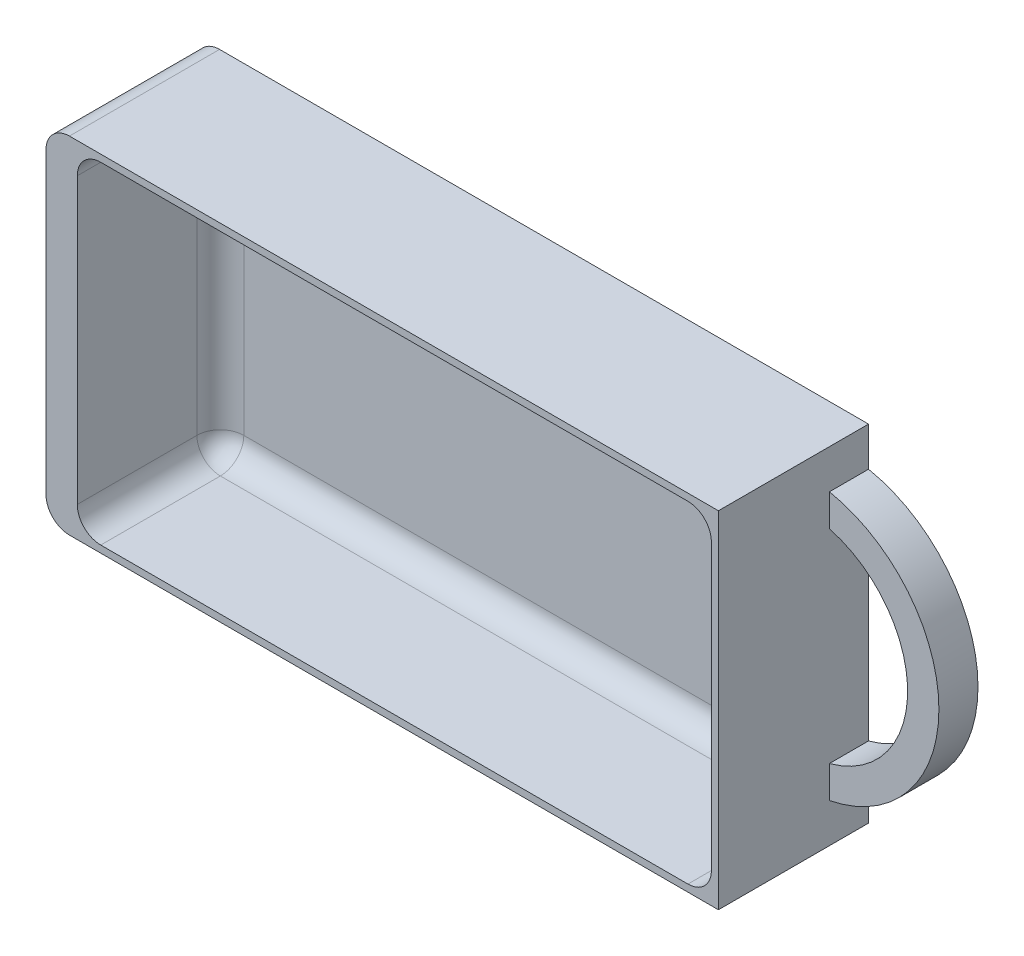
ISO-10303-21;
HEADER;
FILE_DESCRIPTION(('STEP AP214'),'2;1');
FILE_NAME('part.step','',(''),(''),'','','');
FILE_SCHEMA(('AUTOMOTIVE_DESIGN { 1 0 10303 214 1 1 1 1 }'));
ENDSEC;
DATA;
#1=APPLICATION_CONTEXT('core data for automotive mechanical design processes');
#2=APPLICATION_PROTOCOL_DEFINITION('international standard','automotive_design',2000,#1);
#3=PRODUCT_CONTEXT('',#1,'mechanical');
#4=PRODUCT('Part','Part','',(#3));
#5=PRODUCT_RELATED_PRODUCT_CATEGORY('part','',(#4));
#6=PRODUCT_DEFINITION_FORMATION('','',#4);
#7=PRODUCT_DEFINITION_CONTEXT('part definition',#1,'design');
#8=PRODUCT_DEFINITION('design','',#6,#7);
#9=PRODUCT_DEFINITION_SHAPE('','',#8);
#10=(LENGTH_UNIT() NAMED_UNIT(*) SI_UNIT(.MILLI.,.METRE.));
#11=(NAMED_UNIT(*) PLANE_ANGLE_UNIT() SI_UNIT($,.RADIAN.));
#12=(NAMED_UNIT(*) SI_UNIT($,.STERADIAN.) SOLID_ANGLE_UNIT());
#13=UNCERTAINTY_MEASURE_WITH_UNIT(LENGTH_MEASURE(1.E-05),#10,'distance_accuracy_value','');
#14=(GEOMETRIC_REPRESENTATION_CONTEXT(3) GLOBAL_UNCERTAINTY_ASSIGNED_CONTEXT((#13)) GLOBAL_UNIT_ASSIGNED_CONTEXT((#10,
#11,#12)) REPRESENTATION_CONTEXT('',''));
#15=CARTESIAN_POINT('',(0.,0.,0.));
#16=DIRECTION('',(0.,0.,1.));
#17=DIRECTION('',(1.,0.,0.));
#18=AXIS2_PLACEMENT_3D('',#15,#16,#17);
#19=CARTESIAN_POINT('',(86.1,18.2,-5.7));
#20=DIRECTION('',(1.,0.,0.));
#21=DIRECTION('',(0.,1.,0.));
#22=AXIS2_PLACEMENT_3D('',#19,#20,#21);
#23=SPHERICAL_SURFACE('',#22,3.);
#24=CARTESIAN_POINT('',(86.1,18.2,-5.7));
#25=DIRECTION('',(0.,0.,-1.));
#26=DIRECTION('',(-1.,0.,0.));
#27=AXIS2_PLACEMENT_3D('',#24,#25,#26);
#28=CIRCLE('',#27,3.);
#29=CARTESIAN_POINT('',(86.1,21.2,-5.7));
#30=VERTEX_POINT('',#29);
#31=CARTESIAN_POINT('',(89.1,18.2,-5.7));
#32=VERTEX_POINT('',#31);
#33=EDGE_CURVE('E56',#30,#32,#28,.T.);
#34=ORIENTED_EDGE('',*,*,#33,.F.);
#35=CARTESIAN_POINT('',(86.1,18.2,-5.7));
#36=DIRECTION('',(-1.,0.,0.));
#37=DIRECTION('',(0.,0.,1.));
#38=AXIS2_PLACEMENT_3D('',#35,#36,#37);
#39=CIRCLE('',#38,3.);
#40=CARTESIAN_POINT('',(86.1,18.2,-8.7));
#41=VERTEX_POINT('',#40);
#42=EDGE_CURVE('E324',#41,#30,#39,.F.);
#43=ORIENTED_EDGE('',*,*,#42,.F.);
#44=CARTESIAN_POINT('',(86.1,18.2,-5.7));
#45=DIRECTION('',(0.,-1.,0.));
#46=DIRECTION('',(0.,0.,-1.));
#47=AXIS2_PLACEMENT_3D('',#44,#45,#46);
#48=CIRCLE('',#47,3.);
#49=EDGE_CURVE('E336',#41,#32,#48,.T.);
#50=ORIENTED_EDGE('',*,*,#49,.T.);
#51=EDGE_LOOP('',(#34,#43,#50));
#52=FACE_BOUND('',#51,.T.);
#53=ADVANCED_FACE('F33',(#52),#23,.F.);
#54=CARTESIAN_POINT('',(86.1,0.,-5.7));
#55=DIRECTION('',(0.,1.,0.));
#56=DIRECTION('',(-1.,0.,0.));
#57=AXIS2_PLACEMENT_3D('',#54,#55,#56);
#58=CYLINDRICAL_SURFACE('',#57,3.);
#59=ORIENTED_EDGE('',*,*,#49,.F.);
#60=DIRECTION('',(0.,1.,0.));
#61=VECTOR('',#60,1.);
#62=CARTESIAN_POINT('',(86.1,0.,-8.7));
#63=LINE('',#62,#61);
#64=CARTESIAN_POINT('',(86.1,-18.2,-8.7));
#65=VERTEX_POINT('',#64);
#66=EDGE_CURVE('E321',#65,#41,#63,.T.);
#67=ORIENTED_EDGE('',*,*,#66,.F.);
#68=CARTESIAN_POINT('',(86.1,-18.2,-5.7));
#69=DIRECTION('',(0.,-1.,0.));
#70=DIRECTION('',(0.,0.,-1.));
#71=AXIS2_PLACEMENT_3D('',#68,#69,#70);
#72=CIRCLE('',#71,3.);
#73=CARTESIAN_POINT('',(89.1,-18.2,-5.7));
#74=VERTEX_POINT('',#73);
#75=EDGE_CURVE('E334',#65,#74,#72,.T.);
#76=ORIENTED_EDGE('',*,*,#75,.T.);
#77=DIRECTION('',(0.,1.,0.));
#78=VECTOR('',#77,1.);
#79=CARTESIAN_POINT('',(89.1,-21.2,-5.7));
#80=LINE('',#79,#78);
#81=EDGE_CURVE('E312',#32,#74,#80,.F.);
#82=ORIENTED_EDGE('',*,*,#81,.F.);
#83=EDGE_LOOP('',(#59,#67,#76,#82));
#84=FACE_BOUND('',#83,.T.);
#85=ADVANCED_FACE('F342',(#84),#58,.F.);
#86=CARTESIAN_POINT('',(86.1,-18.2,-5.7));
#87=DIRECTION('',(1.,0.,0.));
#88=DIRECTION('',(0.,1.,0.));
#89=AXIS2_PLACEMENT_3D('',#86,#87,#88);
#90=SPHERICAL_SURFACE('',#89,3.);
#91=ORIENTED_EDGE('',*,*,#75,.F.);
#92=CARTESIAN_POINT('',(86.1,-18.2,-5.7));
#93=DIRECTION('',(-1.,0.,0.));
#94=DIRECTION('',(0.,-1.,0.));
#95=AXIS2_PLACEMENT_3D('',#92,#93,#94);
#96=CIRCLE('',#95,3.);
#97=CARTESIAN_POINT('',(86.1,-21.2,-5.7));
#98=VERTEX_POINT('',#97);
#99=EDGE_CURVE('E318',#98,#65,#96,.F.);
#100=ORIENTED_EDGE('',*,*,#99,.F.);
#101=CARTESIAN_POINT('',(86.1,-18.2,-5.7));
#102=DIRECTION('',(0.,0.,1.));
#103=DIRECTION('',(1.,0.,0.));
#104=AXIS2_PLACEMENT_3D('',#101,#102,#103);
#105=CIRCLE('',#104,3.);
#106=EDGE_CURVE('E331',#98,#74,#105,.T.);
#107=ORIENTED_EDGE('',*,*,#106,.T.);
#108=EDGE_LOOP('',(#91,#100,#107));
#109=FACE_BOUND('',#108,.T.);
#110=ADVANCED_FACE('F463',(#109),#90,.F.);
#111=CARTESIAN_POINT('',(86.1,-18.2,-8.7));
#112=DIRECTION('',(0.,0.,1.));
#113=DIRECTION('',(1.,0.,0.));
#114=AXIS2_PLACEMENT_3D('',#111,#112,#113);
#115=CYLINDRICAL_SURFACE('',#114,3.);
#116=ORIENTED_EDGE('',*,*,#106,.F.);
#117=DIRECTION('',(0.,0.,-1.));
#118=VECTOR('',#117,1.);
#119=CARTESIAN_POINT('',(86.1,-21.2,-8.7));
#120=LINE('',#119,#118);
#121=CARTESIAN_POINT('',(86.1,-21.2,9.6));
#122=VERTEX_POINT('',#121);
#123=EDGE_CURVE('E306',#122,#98,#120,.T.);
#124=ORIENTED_EDGE('',*,*,#123,.F.);
#125=CARTESIAN_POINT('',(86.1,-18.2,9.6));
#126=DIRECTION('',(0.,0.,1.));
#127=DIRECTION('',(1.,0.,0.));
#128=AXIS2_PLACEMENT_3D('',#125,#126,#127);
#129=CIRCLE('',#128,3.);
#130=CARTESIAN_POINT('',(89.1,-18.2,9.6));
#131=VERTEX_POINT('',#130);
#132=EDGE_CURVE('E329',#122,#131,#129,.T.);
#133=ORIENTED_EDGE('',*,*,#132,.T.);
#134=DIRECTION('',(0.,0.,-1.));
#135=VECTOR('',#134,1.);
#136=CARTESIAN_POINT('',(89.1,-18.2,-8.7));
#137=LINE('',#136,#135);
#138=EDGE_CURVE('E315',#74,#131,#137,.F.);
#139=ORIENTED_EDGE('',*,*,#138,.F.);
#140=EDGE_LOOP('',(#116,#124,#133,#139));
#141=FACE_BOUND('',#140,.T.);
#142=ADVANCED_FACE('F460',(#141),#115,.F.);
#143=CARTESIAN_POINT('',(86.1,18.2,-8.7));
#144=DIRECTION('',(0.,0.,-1.));
#145=DIRECTION('',(-1.,0.,0.));
#146=AXIS2_PLACEMENT_3D('',#143,#144,#145);
#147=CYLINDRICAL_SURFACE('',#146,3.);
#148=DIRECTION('',(0.,0.,1.));
#149=VECTOR('',#148,1.);
#150=CARTESIAN_POINT('',(86.1,21.2,-8.7));
#151=LINE('',#150,#149);
#152=CARTESIAN_POINT('',(86.1,21.2,9.6));
#153=VERTEX_POINT('',#152);
#154=EDGE_CURVE('E327',#30,#153,#151,.T.);
#155=ORIENTED_EDGE('',*,*,#154,.F.);
#156=ORIENTED_EDGE('',*,*,#33,.T.);
#157=DIRECTION('',(0.,0.,1.));
#158=VECTOR('',#157,1.);
#159=CARTESIAN_POINT('',(89.1,18.2,-8.7));
#160=LINE('',#159,#158);
#161=CARTESIAN_POINT('',(89.1,18.2,9.6));
#162=VERTEX_POINT('',#161);
#163=EDGE_CURVE('E309',#162,#32,#160,.F.);
#164=ORIENTED_EDGE('',*,*,#163,.F.);
#165=CARTESIAN_POINT('',(86.1,18.2,9.6));
#166=DIRECTION('',(0.,0.,1.));
#167=DIRECTION('',(1.,0.,0.));
#168=AXIS2_PLACEMENT_3D('',#165,#166,#167);
#169=CIRCLE('',#168,3.);
#170=EDGE_CURVE('E42',#162,#153,#169,.T.);
#171=ORIENTED_EDGE('',*,*,#170,.T.);
#172=EDGE_LOOP('',(#155,#156,#164,#171));
#173=FACE_BOUND('',#172,.T.);
#174=ADVANCED_FACE('F35',(#173),#147,.F.);
#175=CARTESIAN_POINT('',(11.,-18.2,-5.7));
#176=DIRECTION('',(-1.,0.,0.));
#177=DIRECTION('',(0.,-1.,0.));
#178=AXIS2_PLACEMENT_3D('',#175,#176,#177);
#179=SPHERICAL_SURFACE('',#178,3.);
#180=CARTESIAN_POINT('',(11.,-18.2,-5.7));
#181=DIRECTION('',(0.,0.,-1.));
#182=DIRECTION('',(-1.,0.,0.));
#183=AXIS2_PLACEMENT_3D('',#180,#181,#182);
#184=CIRCLE('',#183,3.);
#185=CARTESIAN_POINT('',(11.,-21.2,-5.7));
#186=VERTEX_POINT('',#185);
#187=CARTESIAN_POINT('',(8.,-18.2,-5.7));
#188=VERTEX_POINT('',#187);
#189=EDGE_CURVE('E302',#186,#188,#184,.T.);
#190=ORIENTED_EDGE('',*,*,#189,.F.);
#191=CARTESIAN_POINT('',(11.,-18.2,-5.7));
#192=DIRECTION('',(-1.,0.,0.));
#193=DIRECTION('',(0.,-1.,0.));
#194=AXIS2_PLACEMENT_3D('',#191,#192,#193);
#195=CIRCLE('',#194,3.);
#196=CARTESIAN_POINT('',(11.,-18.2,-8.7));
#197=VERTEX_POINT('',#196);
#198=EDGE_CURVE('E286',#197,#186,#195,.T.);
#199=ORIENTED_EDGE('',*,*,#198,.F.);
#200=CARTESIAN_POINT('',(11.,-18.2,-5.7));
#201=DIRECTION('',(0.,1.,0.));
#202=DIRECTION('',(0.,0.,1.));
#203=AXIS2_PLACEMENT_3D('',#200,#201,#202);
#204=CIRCLE('',#203,3.);
#205=EDGE_CURVE('E299',#197,#188,#204,.T.);
#206=ORIENTED_EDGE('',*,*,#205,.T.);
#207=EDGE_LOOP('',(#190,#199,#206));
#208=FACE_BOUND('',#207,.T.);
#209=ADVANCED_FACE('F452',(#208),#179,.F.);
#210=CARTESIAN_POINT('',(11.,0.,-5.7));
#211=DIRECTION('',(0.,-1.,0.));
#212=DIRECTION('',(1.,0.,0.));
#213=AXIS2_PLACEMENT_3D('',#210,#211,#212);
#214=CYLINDRICAL_SURFACE('',#213,3.);
#215=ORIENTED_EDGE('',*,*,#205,.F.);
#216=DIRECTION('',(0.,-1.,0.));
#217=VECTOR('',#216,1.);
#218=CARTESIAN_POINT('',(11.,0.,-8.7));
#219=LINE('',#218,#217);
#220=CARTESIAN_POINT('',(11.,18.2,-8.7));
#221=VERTEX_POINT('',#220);
#222=EDGE_CURVE('E283',#221,#197,#219,.T.);
#223=ORIENTED_EDGE('',*,*,#222,.F.);
#224=CARTESIAN_POINT('',(11.,18.2,-5.7));
#225=DIRECTION('',(0.,1.,0.));
#226=DIRECTION('',(0.,0.,1.));
#227=AXIS2_PLACEMENT_3D('',#224,#225,#226);
#228=CIRCLE('',#227,3.);
#229=CARTESIAN_POINT('',(8.,18.2,-5.7));
#230=VERTEX_POINT('',#229);
#231=EDGE_CURVE('E297',#221,#230,#228,.T.);
#232=ORIENTED_EDGE('',*,*,#231,.T.);
#233=DIRECTION('',(0.,-1.,0.));
#234=VECTOR('',#233,1.);
#235=CARTESIAN_POINT('',(8.,21.2,-5.7));
#236=LINE('',#235,#234);
#237=EDGE_CURVE('E274',#188,#230,#236,.F.);
#238=ORIENTED_EDGE('',*,*,#237,.F.);
#239=EDGE_LOOP('',(#215,#223,#232,#238));
#240=FACE_BOUND('',#239,.T.);
#241=ADVANCED_FACE('F448',(#240),#214,.F.);
#242=CARTESIAN_POINT('',(11.,18.2,-5.7));
#243=DIRECTION('',(-1.,0.,0.));
#244=DIRECTION('',(0.,-1.,0.));
#245=AXIS2_PLACEMENT_3D('',#242,#243,#244);
#246=SPHERICAL_SURFACE('',#245,3.);
#247=ORIENTED_EDGE('',*,*,#231,.F.);
#248=CARTESIAN_POINT('',(11.,18.2,-5.7));
#249=DIRECTION('',(-1.,0.,0.));
#250=DIRECTION('',(0.,0.,1.));
#251=AXIS2_PLACEMENT_3D('',#248,#249,#250);
#252=CIRCLE('',#251,3.);
#253=CARTESIAN_POINT('',(11.,21.2,-5.7));
#254=VERTEX_POINT('',#253);
#255=EDGE_CURVE('E280',#254,#221,#252,.T.);
#256=ORIENTED_EDGE('',*,*,#255,.F.);
#257=CARTESIAN_POINT('',(11.,18.2,-5.7));
#258=DIRECTION('',(0.,0.,1.));
#259=DIRECTION('',(1.,0.,0.));
#260=AXIS2_PLACEMENT_3D('',#257,#258,#259);
#261=CIRCLE('',#260,3.);
#262=EDGE_CURVE('E294',#254,#230,#261,.T.);
#263=ORIENTED_EDGE('',*,*,#262,.T.);
#264=EDGE_LOOP('',(#247,#256,#263));
#265=FACE_BOUND('',#264,.T.);
#266=ADVANCED_FACE('F444',(#265),#246,.F.);
#267=CARTESIAN_POINT('',(11.,18.2,-8.7));
#268=DIRECTION('',(0.,0.,1.));
#269=DIRECTION('',(1.,0.,0.));
#270=AXIS2_PLACEMENT_3D('',#267,#268,#269);
#271=CYLINDRICAL_SURFACE('',#270,3.);
#272=ORIENTED_EDGE('',*,*,#262,.F.);
#273=DIRECTION('',(0.,0.,-1.));
#274=VECTOR('',#273,1.);
#275=CARTESIAN_POINT('',(11.,21.2,-8.7));
#276=LINE('',#275,#274);
#277=CARTESIAN_POINT('',(11.,21.2,9.6));
#278=VERTEX_POINT('',#277);
#279=EDGE_CURVE('E268',#278,#254,#276,.T.);
#280=ORIENTED_EDGE('',*,*,#279,.F.);
#281=CARTESIAN_POINT('',(11.,18.2,9.6));
#282=DIRECTION('',(0.,0.,1.));
#283=DIRECTION('',(1.,0.,0.));
#284=AXIS2_PLACEMENT_3D('',#281,#282,#283);
#285=CIRCLE('',#284,3.);
#286=CARTESIAN_POINT('',(8.,18.2,9.6));
#287=VERTEX_POINT('',#286);
#288=EDGE_CURVE('E292',#278,#287,#285,.T.);
#289=ORIENTED_EDGE('',*,*,#288,.T.);
#290=DIRECTION('',(0.,0.,-1.));
#291=VECTOR('',#290,1.);
#292=CARTESIAN_POINT('',(8.,18.2,-8.7));
#293=LINE('',#292,#291);
#294=EDGE_CURVE('E277',#230,#287,#293,.F.);
#295=ORIENTED_EDGE('',*,*,#294,.F.);
#296=EDGE_LOOP('',(#272,#280,#289,#295));
#297=FACE_BOUND('',#296,.T.);
#298=ADVANCED_FACE('F441',(#297),#271,.F.);
#299=CARTESIAN_POINT('',(11.,-18.2,-8.7));
#300=DIRECTION('',(0.,0.,-1.));
#301=DIRECTION('',(-1.,0.,0.));
#302=AXIS2_PLACEMENT_3D('',#299,#300,#301);
#303=CYLINDRICAL_SURFACE('',#302,3.);
#304=DIRECTION('',(0.,0.,1.));
#305=VECTOR('',#304,1.);
#306=CARTESIAN_POINT('',(11.,-21.2,-8.7));
#307=LINE('',#306,#305);
#308=CARTESIAN_POINT('',(11.,-21.2,9.6));
#309=VERTEX_POINT('',#308);
#310=EDGE_CURVE('E289',#186,#309,#307,.T.);
#311=ORIENTED_EDGE('',*,*,#310,.F.);
#312=ORIENTED_EDGE('',*,*,#189,.T.);
#313=DIRECTION('',(0.,0.,1.));
#314=VECTOR('',#313,1.);
#315=CARTESIAN_POINT('',(8.,-18.2,-8.7));
#316=LINE('',#315,#314);
#317=CARTESIAN_POINT('',(8.,-18.2,9.6));
#318=VERTEX_POINT('',#317);
#319=EDGE_CURVE('E271',#318,#188,#316,.F.);
#320=ORIENTED_EDGE('',*,*,#319,.F.);
#321=CARTESIAN_POINT('',(11.,-18.2,9.6));
#322=DIRECTION('',(0.,0.,1.));
#323=DIRECTION('',(1.,0.,0.));
#324=AXIS2_PLACEMENT_3D('',#321,#322,#323);
#325=CIRCLE('',#324,3.);
#326=EDGE_CURVE('E304',#318,#309,#325,.T.);
#327=ORIENTED_EDGE('',*,*,#326,.T.);
#328=EDGE_LOOP('',(#311,#312,#320,#327));
#329=FACE_BOUND('',#328,.T.);
#330=ADVANCED_FACE('F439',(#329),#303,.F.);
#331=CARTESIAN_POINT('',(0.,18.2,-5.7));
#332=DIRECTION('',(-1.,0.,0.));
#333=DIRECTION('',(0.,0.,1.));
#334=AXIS2_PLACEMENT_3D('',#331,#332,#333);
#335=CYLINDRICAL_SURFACE('',#334,3.);
#336=DIRECTION('',(-1.,0.,0.));
#337=VECTOR('',#336,1.);
#338=CARTESIAN_POINT('',(0.,18.2,-8.7));
#339=LINE('',#338,#337);
#340=EDGE_CURVE('E263',#41,#221,#339,.T.);
#341=ORIENTED_EDGE('',*,*,#340,.F.);
#342=ORIENTED_EDGE('',*,*,#42,.T.);
#343=DIRECTION('',(-1.,0.,0.));
#344=VECTOR('',#343,1.);
#345=CARTESIAN_POINT('',(89.1,21.2,-5.7));
#346=LINE('',#345,#344);
#347=EDGE_CURVE('E265',#254,#30,#346,.F.);
#348=ORIENTED_EDGE('',*,*,#347,.F.);
#349=ORIENTED_EDGE('',*,*,#255,.T.);
#350=EDGE_LOOP('',(#341,#342,#348,#349));
#351=FACE_BOUND('',#350,.T.);
#352=ADVANCED_FACE('F435',(#351),#335,.F.);
#353=CARTESIAN_POINT('',(8.,-18.2,-5.7));
#354=DIRECTION('',(-1.,0.,0.));
#355=DIRECTION('',(0.,-1.,0.));
#356=AXIS2_PLACEMENT_3D('',#353,#354,#355);
#357=CYLINDRICAL_SURFACE('',#356,3.);
#358=DIRECTION('',(-1.,0.,0.));
#359=VECTOR('',#358,1.);
#360=CARTESIAN_POINT('',(8.,-21.2,-5.7));
#361=LINE('',#360,#359);
#362=EDGE_CURVE('E258',#98,#186,#361,.T.);
#363=ORIENTED_EDGE('',*,*,#362,.F.);
#364=ORIENTED_EDGE('',*,*,#99,.T.);
#365=DIRECTION('',(-1.,0.,0.));
#366=VECTOR('',#365,1.);
#367=CARTESIAN_POINT('',(0.,-18.2,-8.7));
#368=LINE('',#367,#366);
#369=EDGE_CURVE('E260',#197,#65,#368,.F.);
#370=ORIENTED_EDGE('',*,*,#369,.F.);
#371=ORIENTED_EDGE('',*,*,#198,.T.);
#372=EDGE_LOOP('',(#363,#364,#370,#371));
#373=FACE_BOUND('',#372,.T.);
#374=ADVANCED_FACE('F425',(#373),#357,.F.);
#375=CARTESIAN_POINT('',(4.,-22.1,-4.6));
#376=DIRECTION('',(0.,-1.,0.));
#377=DIRECTION('',(1.,0.,0.));
#378=AXIS2_PLACEMENT_3D('',#375,#376,#377);
#379=PLANE('',#378);
#380=DIRECTION('',(1.,0.,0.));
#381=VECTOR('',#380,1.);
#382=CARTESIAN_POINT('',(4.,-22.1,9.6));
#383=LINE('',#382,#381);
#384=CARTESIAN_POINT('',(7.,-22.1,9.6));
#385=VERTEX_POINT('',#384);
#386=CARTESIAN_POINT('',(90.,-22.1,9.6));
#387=VERTEX_POINT('',#386);
#388=EDGE_CURVE('E221',#385,#387,#383,.T.);
#389=ORIENTED_EDGE('',*,*,#388,.F.);
#390=DIRECTION('',(0.,0.,1.));
#391=VECTOR('',#390,1.);
#392=CARTESIAN_POINT('',(7.,-22.1,-4.6));
#393=LINE('',#392,#391);
#394=CARTESIAN_POINT('',(7.,-22.1,-9.6));
#395=VERTEX_POINT('',#394);
#396=EDGE_CURVE('E249',#385,#395,#393,.F.);
#397=ORIENTED_EDGE('',*,*,#396,.T.);
#398=DIRECTION('',(-1.,0.,0.));
#399=VECTOR('',#398,1.);
#400=CARTESIAN_POINT('',(4.,-22.1,-9.6));
#401=LINE('',#400,#399);
#402=CARTESIAN_POINT('',(90.,-22.1,-9.6));
#403=VERTEX_POINT('',#402);
#404=EDGE_CURVE('E199',#403,#395,#401,.T.);
#405=ORIENTED_EDGE('',*,*,#404,.F.);
#406=DIRECTION('',(0.,0.,1.));
#407=VECTOR('',#406,1.);
#408=CARTESIAN_POINT('',(90.,-22.1,-4.6));
#409=LINE('',#408,#407);
#410=EDGE_CURVE('E238',#403,#387,#409,.T.);
#411=ORIENTED_EDGE('',*,*,#410,.T.);
#412=EDGE_LOOP('',(#389,#397,#405,#411));
#413=FACE_BOUND('',#412,.T.);
#414=ADVANCED_FACE('F416',(#413),#379,.T.);
#415=CARTESIAN_POINT('',(4.,22.1,-4.6));
#416=DIRECTION('',(-1.,0.,0.));
#417=DIRECTION('',(0.,0.,1.));
#418=AXIS2_PLACEMENT_3D('',#415,#416,#417);
#419=PLANE('',#418);
#420=DIRECTION('',(0.,1.,0.));
#421=VECTOR('',#420,1.);
#422=CARTESIAN_POINT('',(4.,22.1,-9.6));
#423=LINE('',#422,#421);
#424=CARTESIAN_POINT('',(4.,-19.1,-9.6));
#425=VERTEX_POINT('',#424);
#426=CARTESIAN_POINT('',(4.,19.1,-9.6));
#427=VERTEX_POINT('',#426);
#428=EDGE_CURVE('E202',#425,#427,#423,.T.);
#429=ORIENTED_EDGE('',*,*,#428,.F.);
#430=DIRECTION('',(0.,0.,1.));
#431=VECTOR('',#430,1.);
#432=CARTESIAN_POINT('',(4.,-19.1,-4.6));
#433=LINE('',#432,#431);
#434=CARTESIAN_POINT('',(4.,-19.1,9.6));
#435=VERTEX_POINT('',#434);
#436=EDGE_CURVE('E242',#425,#435,#433,.T.);
#437=ORIENTED_EDGE('',*,*,#436,.T.);
#438=DIRECTION('',(0.,-1.,0.));
#439=VECTOR('',#438,1.);
#440=CARTESIAN_POINT('',(4.,22.1,9.6));
#441=LINE('',#440,#439);
#442=CARTESIAN_POINT('',(4.,19.1,9.6));
#443=VERTEX_POINT('',#442);
#444=EDGE_CURVE('E225',#443,#435,#441,.T.);
#445=ORIENTED_EDGE('',*,*,#444,.F.);
#446=DIRECTION('',(0.,0.,1.));
#447=VECTOR('',#446,1.);
#448=CARTESIAN_POINT('',(4.,19.1,-4.6));
#449=LINE('',#448,#447);
#450=EDGE_CURVE('E237',#443,#427,#449,.F.);
#451=ORIENTED_EDGE('',*,*,#450,.T.);
#452=EDGE_LOOP('',(#429,#437,#445,#451));
#453=FACE_BOUND('',#452,.T.);
#454=ADVANCED_FACE('F412',(#453),#419,.T.);
#455=CARTESIAN_POINT('',(90.,22.1,-4.6));
#456=DIRECTION('',(0.,1.,0.));
#457=DIRECTION('',(-1.,0.,0.));
#458=AXIS2_PLACEMENT_3D('',#455,#456,#457);
#459=PLANE('',#458);
#460=DIRECTION('',(1.,0.,0.));
#461=VECTOR('',#460,1.);
#462=CARTESIAN_POINT('',(90.,22.1,-9.6));
#463=LINE('',#462,#461);
#464=CARTESIAN_POINT('',(7.00000000000001,22.1,-9.6));
#465=VERTEX_POINT('',#464);
#466=CARTESIAN_POINT('',(90.,22.1,-9.6));
#467=VERTEX_POINT('',#466);
#468=EDGE_CURVE('E205',#465,#467,#463,.T.);
#469=ORIENTED_EDGE('',*,*,#468,.F.);
#470=DIRECTION('',(0.,0.,1.));
#471=VECTOR('',#470,1.);
#472=CARTESIAN_POINT('',(7.00000000000001,22.1,-4.6));
#473=LINE('',#472,#471);
#474=CARTESIAN_POINT('',(7.00000000000001,22.1,9.6));
#475=VERTEX_POINT('',#474);
#476=EDGE_CURVE('E255',#465,#475,#473,.T.);
#477=ORIENTED_EDGE('',*,*,#476,.T.);
#478=DIRECTION('',(-1.,0.,0.));
#479=VECTOR('',#478,1.);
#480=CARTESIAN_POINT('',(90.,22.1,9.6));
#481=LINE('',#480,#479);
#482=CARTESIAN_POINT('',(90.,22.1,9.6));
#483=VERTEX_POINT('',#482);
#484=EDGE_CURVE('E230',#483,#475,#481,.T.);
#485=ORIENTED_EDGE('',*,*,#484,.F.);
#486=DIRECTION('',(0.,0.,1.));
#487=VECTOR('',#486,1.);
#488=CARTESIAN_POINT('',(90.,22.1,-4.6));
#489=LINE('',#488,#487);
#490=EDGE_CURVE('E235',#467,#483,#489,.T.);
#491=ORIENTED_EDGE('',*,*,#490,.F.);
#492=EDGE_LOOP('',(#469,#477,#485,#491));
#493=FACE_BOUND('',#492,.T.);
#494=ADVANCED_FACE('F415',(#493),#459,.T.);
#495=CARTESIAN_POINT('',(90.,-22.1,-4.6));
#496=DIRECTION('',(1.,0.,0.));
#497=DIRECTION('',(0.,0.,-1.));
#498=AXIS2_PLACEMENT_3D('',#495,#496,#497);
#499=PLANE('',#498);
#500=DIRECTION('',(0.,1.,0.));
#501=VECTOR('',#500,1.);
#502=CARTESIAN_POINT('',(90.,-22.1,9.6));
#503=LINE('',#502,#501);
#504=EDGE_CURVE('E227',#387,#483,#503,.T.);
#505=ORIENTED_EDGE('',*,*,#504,.F.);
#506=ORIENTED_EDGE('',*,*,#410,.F.);
#507=DIRECTION('',(0.,-1.,0.));
#508=VECTOR('',#507,1.);
#509=CARTESIAN_POINT('',(90.,-22.1,-9.6));
#510=LINE('',#509,#508);
#511=CARTESIAN_POINT('',(90.,-17.1,-9.6));
#512=VERTEX_POINT('',#511);
#513=EDGE_CURVE('E211',#512,#403,#510,.T.);
#514=ORIENTED_EDGE('',*,*,#513,.F.);
#515=DIRECTION('',(0.,0.,1.));
#516=VECTOR('',#515,1.);
#517=CARTESIAN_POINT('',(90.,-17.1,-9.6));
#518=LINE('',#517,#516);
#519=CARTESIAN_POINT('',(90.,-17.1,-4.6));
#520=VERTEX_POINT('',#519);
#521=EDGE_CURVE('E214',#512,#520,#518,.T.);
#522=ORIENTED_EDGE('',*,*,#521,.T.);
#523=DIRECTION('',(0.,1.,0.));
#524=VECTOR('',#523,1.);
#525=CARTESIAN_POINT('',(90.,-22.1,-4.6));
#526=LINE('',#525,#524);
#527=CARTESIAN_POINT('',(90.,-12.9947791714321,-4.6));
#528=VERTEX_POINT('',#527);
#529=EDGE_CURVE('E224',#520,#528,#526,.T.);
#530=ORIENTED_EDGE('',*,*,#529,.T.);
#531=DIRECTION('',(0.,0.,1.));
#532=VECTOR('',#531,1.);
#533=CARTESIAN_POINT('',(90.,-12.9947791714321,-9.6));
#534=LINE('',#533,#532);
#535=CARTESIAN_POINT('',(90.,-12.9947791714321,-9.6));
#536=VERTEX_POINT('',#535);
#537=EDGE_CURVE('E178',#536,#528,#534,.T.);
#538=ORIENTED_EDGE('',*,*,#537,.F.);
#539=DIRECTION('',(0.,1.,0.));
#540=VECTOR('',#539,1.);
#541=CARTESIAN_POINT('',(90.,-12.9947791714321,-9.6));
#542=LINE('',#541,#540);
#543=CARTESIAN_POINT('',(90.,12.9947791714321,-9.6));
#544=VERTEX_POINT('',#543);
#545=EDGE_CURVE('E171',#536,#544,#542,.T.);
#546=ORIENTED_EDGE('',*,*,#545,.T.);
#547=DIRECTION('',(0.,0.,1.));
#548=VECTOR('',#547,1.);
#549=CARTESIAN_POINT('',(90.,12.9947791714321,-9.6));
#550=LINE('',#549,#548);
#551=CARTESIAN_POINT('',(90.,12.9947791714321,-4.6));
#552=VERTEX_POINT('',#551);
#553=EDGE_CURVE('E176',#544,#552,#550,.T.);
#554=ORIENTED_EDGE('',*,*,#553,.T.);
#555=CARTESIAN_POINT('',(90.,17.1,-4.6));
#556=VERTEX_POINT('',#555);
#557=EDGE_CURVE('E222',#552,#556,#526,.T.);
#558=ORIENTED_EDGE('',*,*,#557,.T.);
#559=DIRECTION('',(0.,0.,1.));
#560=VECTOR('',#559,1.);
#561=CARTESIAN_POINT('',(90.,17.1,-9.6));
#562=LINE('',#561,#560);
#563=CARTESIAN_POINT('',(90.,17.1,-9.6));
#564=VERTEX_POINT('',#563);
#565=EDGE_CURVE('E219',#564,#556,#562,.T.);
#566=ORIENTED_EDGE('',*,*,#565,.F.);
#567=DIRECTION('',(0.,-1.,0.));
#568=VECTOR('',#567,1.);
#569=CARTESIAN_POINT('',(90.,17.1,-9.6));
#570=LINE('',#569,#568);
#571=EDGE_CURVE('E207',#467,#564,#570,.T.);
#572=ORIENTED_EDGE('',*,*,#571,.F.);
#573=ORIENTED_EDGE('',*,*,#490,.T.);
#574=EDGE_LOOP('',(#505,#506,#514,#522,#530,#538,#546,#554,#558,#566,#572,#573));
#575=FACE_BOUND('',#574,.T.);
#576=ADVANCED_FACE('F174',(#575),#499,.T.);
#577=CARTESIAN_POINT('',(0.,0.,9.6));
#578=DIRECTION('',(0.,0.,1.));
#579=DIRECTION('',(1.,0.,0.));
#580=AXIS2_PLACEMENT_3D('',#577,#578,#579);
#581=PLANE('',#580);
#582=DIRECTION('',(1.,0.,0.));
#583=VECTOR('',#582,1.);
#584=CARTESIAN_POINT('',(8.,-21.2,9.6));
#585=LINE('',#584,#583);
#586=EDGE_CURVE('E350',#309,#122,#585,.T.);
#587=ORIENTED_EDGE('',*,*,#586,.F.);
#588=ORIENTED_EDGE('',*,*,#326,.F.);
#589=DIRECTION('',(0.,-1.,0.));
#590=VECTOR('',#589,1.);
#591=CARTESIAN_POINT('',(8.,21.2,9.6));
#592=LINE('',#591,#590);
#593=EDGE_CURVE('E192',#287,#318,#592,.T.);
#594=ORIENTED_EDGE('',*,*,#593,.F.);
#595=ORIENTED_EDGE('',*,*,#288,.F.);
#596=DIRECTION('',(-1.,0.,0.));
#597=VECTOR('',#596,1.);
#598=CARTESIAN_POINT('',(89.1,21.2,9.6));
#599=LINE('',#598,#597);
#600=EDGE_CURVE('E349',#153,#278,#599,.T.);
#601=ORIENTED_EDGE('',*,*,#600,.F.);
#602=ORIENTED_EDGE('',*,*,#170,.F.);
#603=DIRECTION('',(0.,1.,0.));
#604=VECTOR('',#603,1.);
#605=CARTESIAN_POINT('',(89.1,-21.2,9.6));
#606=LINE('',#605,#604);
#607=EDGE_CURVE('E346',#131,#162,#606,.T.);
#608=ORIENTED_EDGE('',*,*,#607,.F.);
#609=ORIENTED_EDGE('',*,*,#132,.F.);
#610=EDGE_LOOP('',(#587,#588,#594,#595,#601,#602,#608,#609));
#611=FACE_BOUND('',#610,.T.);
#612=ORIENTED_EDGE('',*,*,#444,.T.);
#613=CARTESIAN_POINT('',(7.,-19.1,9.6));
#614=DIRECTION('',(0.,0.,1.));
#615=DIRECTION('',(1.,0.,0.));
#616=AXIS2_PLACEMENT_3D('',#613,#614,#615);
#617=CIRCLE('',#616,3.);
#618=EDGE_CURVE('E247',#435,#385,#617,.T.);
#619=ORIENTED_EDGE('',*,*,#618,.T.);
#620=ORIENTED_EDGE('',*,*,#388,.T.);
#621=ORIENTED_EDGE('',*,*,#504,.T.);
#622=ORIENTED_EDGE('',*,*,#484,.T.);
#623=CARTESIAN_POINT('',(7.00000000000001,19.1,9.6));
#624=DIRECTION('',(0.,0.,1.));
#625=DIRECTION('',(1.,0.,0.));
#626=AXIS2_PLACEMENT_3D('',#623,#624,#625);
#627=CIRCLE('',#626,3.);
#628=EDGE_CURVE('E245',#475,#443,#627,.T.);
#629=ORIENTED_EDGE('',*,*,#628,.T.);
#630=EDGE_LOOP('',(#612,#619,#620,#621,#622,#629));
#631=FACE_BOUND('',#630,.T.);
#632=ADVANCED_FACE('F405',(#611,#631),#581,.T.);
#633=CARTESIAN_POINT('',(86.5567857142857,0.,-4.6));
#634=DIRECTION('',(0.,0.,1.));
#635=DIRECTION('',(1.,0.,0.));
#636=AXIS2_PLACEMENT_3D('',#633,#634,#635);
#637=PLANE('',#636);
#638=ORIENTED_EDGE('',*,*,#529,.F.);
#639=CARTESIAN_POINT('',(86.5567857142857,0.,-4.6));
#640=DIRECTION('',(0.,0.,-1.));
#641=DIRECTION('',(1.,0.,0.));
#642=AXIS2_PLACEMENT_3D('',#639,#640,#641);
#643=CIRCLE('',#642,17.4432142857143);
#644=EDGE_CURVE('E198',#556,#520,#643,.T.);
#645=ORIENTED_EDGE('',*,*,#644,.F.);
#646=ORIENTED_EDGE('',*,*,#557,.F.);
#647=CARTESIAN_POINT('',(86.5567857142857,0.,-4.6));
#648=DIRECTION('',(0.,0.,-1.));
#649=DIRECTION('',(-1.,0.,0.));
#650=AXIS2_PLACEMENT_3D('',#647,#648,#649);
#651=CIRCLE('',#650,13.4432142857143);
#652=EDGE_CURVE('E188',#552,#528,#651,.T.);
#653=ORIENTED_EDGE('',*,*,#652,.T.);
#654=EDGE_LOOP('',(#638,#645,#646,#653));
#655=FACE_BOUND('',#654,.T.);
#656=ADVANCED_FACE('F401',(#655),#637,.T.);
#657=CARTESIAN_POINT('',(86.5567857142857,0.,-9.6));
#658=DIRECTION('',(0.,0.,1.));
#659=DIRECTION('',(1.,0.,0.));
#660=AXIS2_PLACEMENT_3D('',#657,#658,#659);
#661=PLANE('',#660);
#662=ORIENTED_EDGE('',*,*,#404,.T.);
#663=CARTESIAN_POINT('',(7.,-19.1,-9.6));
#664=DIRECTION('',(0.,0.,1.));
#665=DIRECTION('',(1.,0.,0.));
#666=AXIS2_PLACEMENT_3D('',#663,#664,#665);
#667=CIRCLE('',#666,3.);
#668=EDGE_CURVE('E253',#395,#425,#667,.F.);
#669=ORIENTED_EDGE('',*,*,#668,.T.);
#670=ORIENTED_EDGE('',*,*,#428,.T.);
#671=CARTESIAN_POINT('',(7.00000000000001,19.1,-9.6));
#672=DIRECTION('',(0.,0.,1.));
#673=DIRECTION('',(1.,0.,0.));
#674=AXIS2_PLACEMENT_3D('',#671,#672,#673);
#675=CIRCLE('',#674,3.);
#676=EDGE_CURVE('E251',#427,#465,#675,.F.);
#677=ORIENTED_EDGE('',*,*,#676,.T.);
#678=ORIENTED_EDGE('',*,*,#468,.T.);
#679=ORIENTED_EDGE('',*,*,#571,.T.);
#680=CARTESIAN_POINT('',(86.5567857142857,0.,-9.6));
#681=DIRECTION('',(0.,0.,-1.));
#682=DIRECTION('',(1.,0.,0.));
#683=AXIS2_PLACEMENT_3D('',#680,#681,#682);
#684=CIRCLE('',#683,17.4432142857143);
#685=EDGE_CURVE('E209',#564,#512,#684,.T.);
#686=ORIENTED_EDGE('',*,*,#685,.T.);
#687=ORIENTED_EDGE('',*,*,#513,.T.);
#688=EDGE_LOOP('',(#662,#669,#670,#677,#678,#679,#686,#687));
#689=FACE_BOUND('',#688,.T.);
#690=CARTESIAN_POINT('',(86.5567857142857,0.,-9.6));
#691=DIRECTION('',(0.,0.,-1.));
#692=DIRECTION('',(-1.,0.,0.));
#693=AXIS2_PLACEMENT_3D('',#690,#691,#692);
#694=CIRCLE('',#693,13.4432142857143);
#695=EDGE_CURVE('E182',#544,#536,#694,.T.);
#696=ORIENTED_EDGE('',*,*,#695,.F.);
#697=ORIENTED_EDGE('',*,*,#545,.F.);
#698=EDGE_LOOP('',(#696,#697));
#699=FACE_BOUND('',#698,.T.);
#700=ADVANCED_FACE('F190',(#689,#699),#661,.F.);
#701=CARTESIAN_POINT('',(86.5567857142857,0.,-9.6));
#702=DIRECTION('',(0.,0.,1.));
#703=DIRECTION('',(1.,0.,0.));
#704=AXIS2_PLACEMENT_3D('',#701,#702,#703);
#705=CYLINDRICAL_SURFACE('',#704,17.4432142857143);
#706=ORIENTED_EDGE('',*,*,#644,.T.);
#707=ORIENTED_EDGE('',*,*,#521,.F.);
#708=ORIENTED_EDGE('',*,*,#685,.F.);
#709=ORIENTED_EDGE('',*,*,#565,.T.);
#710=EDGE_LOOP('',(#706,#707,#708,#709));
#711=FACE_BOUND('',#710,.T.);
#712=ADVANCED_FACE('F398',(#711),#705,.T.);
#713=CARTESIAN_POINT('',(86.5567857142857,0.,-9.6));
#714=DIRECTION('',(0.,0.,1.));
#715=DIRECTION('',(1.,0.,0.));
#716=AXIS2_PLACEMENT_3D('',#713,#714,#715);
#717=CYLINDRICAL_SURFACE('',#716,13.4432142857143);
#718=ORIENTED_EDGE('',*,*,#652,.F.);
#719=ORIENTED_EDGE('',*,*,#553,.F.);
#720=ORIENTED_EDGE('',*,*,#695,.T.);
#721=ORIENTED_EDGE('',*,*,#537,.T.);
#722=EDGE_LOOP('',(#718,#719,#720,#721));
#723=FACE_BOUND('',#722,.T.);
#724=ADVANCED_FACE('F186',(#723),#717,.F.);
#725=CARTESIAN_POINT('',(8.,-21.2,-8.7));
#726=DIRECTION('',(0.,-1.,0.));
#727=DIRECTION('',(1.,0.,0.));
#728=AXIS2_PLACEMENT_3D('',#725,#726,#727);
#729=PLANE('',#728);
#730=ORIENTED_EDGE('',*,*,#586,.T.);
#731=ORIENTED_EDGE('',*,*,#123,.T.);
#732=ORIENTED_EDGE('',*,*,#362,.T.);
#733=ORIENTED_EDGE('',*,*,#310,.T.);
#734=EDGE_LOOP('',(#730,#731,#732,#733));
#735=FACE_BOUND('',#734,.T.);
#736=ADVANCED_FACE('F386',(#735),#729,.F.);
#737=CARTESIAN_POINT('',(8.,21.2,-8.7));
#738=DIRECTION('',(-1.,0.,0.));
#739=DIRECTION('',(0.,-1.,0.));
#740=AXIS2_PLACEMENT_3D('',#737,#738,#739);
#741=PLANE('',#740);
#742=ORIENTED_EDGE('',*,*,#237,.T.);
#743=ORIENTED_EDGE('',*,*,#294,.T.);
#744=ORIENTED_EDGE('',*,*,#593,.T.);
#745=ORIENTED_EDGE('',*,*,#319,.T.);
#746=EDGE_LOOP('',(#742,#743,#744,#745));
#747=FACE_BOUND('',#746,.T.);
#748=ADVANCED_FACE('F382',(#747),#741,.F.);
#749=CARTESIAN_POINT('',(89.1,21.2,-8.7));
#750=DIRECTION('',(0.,1.,0.));
#751=DIRECTION('',(0.,0.,1.));
#752=AXIS2_PLACEMENT_3D('',#749,#750,#751);
#753=PLANE('',#752);
#754=ORIENTED_EDGE('',*,*,#347,.T.);
#755=ORIENTED_EDGE('',*,*,#154,.T.);
#756=ORIENTED_EDGE('',*,*,#600,.T.);
#757=ORIENTED_EDGE('',*,*,#279,.T.);
#758=EDGE_LOOP('',(#754,#755,#756,#757));
#759=FACE_BOUND('',#758,.T.);
#760=ADVANCED_FACE('F385',(#759),#753,.F.);
#761=CARTESIAN_POINT('',(89.1,-21.2,-8.7));
#762=DIRECTION('',(1.,0.,0.));
#763=DIRECTION('',(0.,1.,0.));
#764=AXIS2_PLACEMENT_3D('',#761,#762,#763);
#765=PLANE('',#764);
#766=ORIENTED_EDGE('',*,*,#81,.T.);
#767=ORIENTED_EDGE('',*,*,#138,.T.);
#768=ORIENTED_EDGE('',*,*,#607,.T.);
#769=ORIENTED_EDGE('',*,*,#163,.T.);
#770=EDGE_LOOP('',(#766,#767,#768,#769));
#771=FACE_BOUND('',#770,.T.);
#772=ADVANCED_FACE('F344',(#771),#765,.F.);
#773=CARTESIAN_POINT('',(0.,0.,-8.7));
#774=DIRECTION('',(0.,0.,1.));
#775=DIRECTION('',(1.,0.,0.));
#776=AXIS2_PLACEMENT_3D('',#773,#774,#775);
#777=PLANE('',#776);
#778=ORIENTED_EDGE('',*,*,#369,.T.);
#779=ORIENTED_EDGE('',*,*,#66,.T.);
#780=ORIENTED_EDGE('',*,*,#340,.T.);
#781=ORIENTED_EDGE('',*,*,#222,.T.);
#782=EDGE_LOOP('',(#778,#779,#780,#781));
#783=FACE_BOUND('',#782,.T.);
#784=ADVANCED_FACE('F377',(#783),#777,.T.);
#785=CARTESIAN_POINT('',(7.,-19.1,-4.6));
#786=DIRECTION('',(0.,0.,1.));
#787=DIRECTION('',(1.,0.,0.));
#788=AXIS2_PLACEMENT_3D('',#785,#786,#787);
#789=CYLINDRICAL_SURFACE('',#788,3.);
#790=ORIENTED_EDGE('',*,*,#668,.F.);
#791=ORIENTED_EDGE('',*,*,#396,.F.);
#792=ORIENTED_EDGE('',*,*,#618,.F.);
#793=ORIENTED_EDGE('',*,*,#436,.F.);
#794=EDGE_LOOP('',(#790,#791,#792,#793));
#795=FACE_BOUND('',#794,.T.);
#796=ADVANCED_FACE('F380',(#795),#789,.T.);
#797=CARTESIAN_POINT('',(7.00000000000001,19.1,-4.6));
#798=DIRECTION('',(0.,0.,1.));
#799=DIRECTION('',(1.,0.,0.));
#800=AXIS2_PLACEMENT_3D('',#797,#798,#799);
#801=CYLINDRICAL_SURFACE('',#800,3.);
#802=ORIENTED_EDGE('',*,*,#676,.F.);
#803=ORIENTED_EDGE('',*,*,#450,.F.);
#804=ORIENTED_EDGE('',*,*,#628,.F.);
#805=ORIENTED_EDGE('',*,*,#476,.F.);
#806=EDGE_LOOP('',(#802,#803,#804,#805));
#807=FACE_BOUND('',#806,.T.);
#808=ADVANCED_FACE('F429',(#807),#801,.T.);
#809=CLOSED_SHELL('',(#53,#85,#110,#142,#174,#209,#241,#266,#298,#330,#352,#374,#414,#454,#494,
#576,#632,#656,#700,#712,#724,#736,#748,#760,#772,#784,#796,#808));
#810=CARTESIAN_POINT('',(7.,0.,0.));
#811=DIRECTION('',(-1.,0.,0.));
#812=DIRECTION('',(0.,0.,1.));
#813=AXIS2_PLACEMENT_3D('',#810,#811,#812);
#814=PLANE('',#813);
#815=CARTESIAN_POINT('',(7.,0.,0.));
#816=DIRECTION('',(-1.,0.,0.));
#817=DIRECTION('',(0.,0.,1.));
#818=AXIS2_PLACEMENT_3D('',#815,#816,#817);
#819=CIRCLE('',#818,4.14999999999999);
#820=CARTESIAN_POINT('',(7.,0.,4.14999999999999));
#821=VERTEX_POINT('',#820);
#822=EDGE_CURVE('E11',#821,#821,#819,.F.);
#823=ORIENTED_EDGE('',*,*,#822,.T.);
#824=EDGE_LOOP('',(#823));
#825=FACE_BOUND('',#824,.T.);
#826=ADVANCED_FACE('F368',(#825),#814,.F.);
#827=CARTESIAN_POINT('',(7.19999999999999,0.,0.));
#828=DIRECTION('',(1.,0.,0.));
#829=DIRECTION('',(0.,0.,-1.));
#830=AXIS2_PLACEMENT_3D('',#827,#828,#829);
#831=PLANE('',#830);
#832=CARTESIAN_POINT('',(7.19999999999999,0.,0.));
#833=DIRECTION('',(-1.,0.,0.));
#834=DIRECTION('',(0.,0.,1.));
#835=AXIS2_PLACEMENT_3D('',#832,#833,#834);
#836=CIRCLE('',#835,4.14999999999999);
#837=CARTESIAN_POINT('',(7.19999999999999,0.,4.14999999999999));
#838=VERTEX_POINT('',#837);
#839=EDGE_CURVE('E353',#838,#838,#836,.T.);
#840=ORIENTED_EDGE('',*,*,#839,.T.);
#841=EDGE_LOOP('',(#840));
#842=FACE_BOUND('',#841,.T.);
#843=ADVANCED_FACE('F359',(#842),#831,.F.);
#844=CARTESIAN_POINT('',(4.,0.,0.));
#845=DIRECTION('',(-1.,0.,0.));
#846=DIRECTION('',(0.,0.,1.));
#847=AXIS2_PLACEMENT_3D('',#844,#845,#846);
#848=CYLINDRICAL_SURFACE('',#847,4.14999999999999);
#849=ORIENTED_EDGE('',*,*,#839,.F.);
#850=EDGE_LOOP('',(#849));
#851=FACE_BOUND('',#850,.T.);
#852=ORIENTED_EDGE('',*,*,#822,.F.);
#853=EDGE_LOOP('',(#852));
#854=FACE_BOUND('',#853,.T.);
#855=ADVANCED_FACE('F361',(#851,#854),#848,.F.);
#856=CLOSED_SHELL('',(#826,#843,#855));
#857=ORIENTED_CLOSED_SHELL('',*,#856,.T.);
#858=BREP_WITH_VOIDS('B2',#809,(#857));
#859=ADVANCED_BREP_SHAPE_REPRESENTATION('',(#18,#858),#14);
#860=SHAPE_DEFINITION_REPRESENTATION(#9,#859);
ENDSEC;
END-ISO-10303-21;
